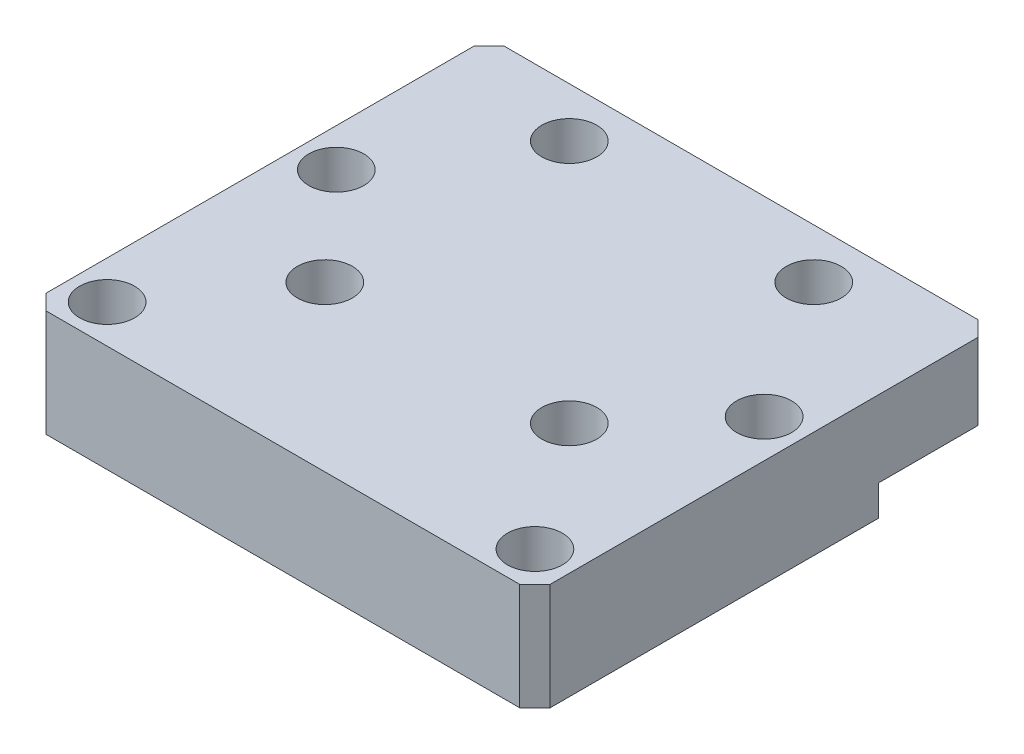
ISO-10303-21;
HEADER;
FILE_DESCRIPTION(('STEP AP214'),'2;1');
FILE_NAME('part.step','',(''),(''),'','','');
FILE_SCHEMA(('AUTOMOTIVE_DESIGN { 1 0 10303 214 1 1 1 1 }'));
ENDSEC;
DATA;
#1=APPLICATION_CONTEXT('core data for automotive mechanical design processes');
#2=APPLICATION_PROTOCOL_DEFINITION('international standard','automotive_design',2000,#1);
#3=PRODUCT_CONTEXT('',#1,'mechanical');
#4=PRODUCT('Part','Part','',(#3));
#5=PRODUCT_RELATED_PRODUCT_CATEGORY('part','',(#4));
#6=PRODUCT_DEFINITION_FORMATION('','',#4);
#7=PRODUCT_DEFINITION_CONTEXT('part definition',#1,'design');
#8=PRODUCT_DEFINITION('design','',#6,#7);
#9=PRODUCT_DEFINITION_SHAPE('','',#8);
#10=(LENGTH_UNIT() NAMED_UNIT(*) SI_UNIT(.MILLI.,.METRE.));
#11=(NAMED_UNIT(*) PLANE_ANGLE_UNIT() SI_UNIT($,.RADIAN.));
#12=(NAMED_UNIT(*) SI_UNIT($,.STERADIAN.) SOLID_ANGLE_UNIT());
#13=UNCERTAINTY_MEASURE_WITH_UNIT(LENGTH_MEASURE(1.E-05),#10,'distance_accuracy_value','');
#14=(GEOMETRIC_REPRESENTATION_CONTEXT(3) GLOBAL_UNCERTAINTY_ASSIGNED_CONTEXT((#13)) GLOBAL_UNIT_ASSIGNED_CONTEXT((#10,
#11,#12)) REPRESENTATION_CONTEXT('',''));
#15=CARTESIAN_POINT('',(0.,0.,0.));
#16=DIRECTION('',(0.,0.,1.));
#17=DIRECTION('',(1.,0.,0.));
#18=AXIS2_PLACEMENT_3D('',#15,#16,#17);
#19=CARTESIAN_POINT('',(14.6058681568461,-50.686690807351,-11.25));
#20=DIRECTION('',(-0.793353340291234,0.,-0.608761429008722));
#21=DIRECTION('',(-0.608761429008722,0.,0.793353340291234));
#22=AXIS2_PLACEMENT_3D('',#19,#20,#21);
#23=PLANE('',#22);
#24=DIRECTION('',(0.608761429008722,0.,-0.793353340291234));
#25=VECTOR('',#24,1.);
#26=CARTESIAN_POINT('',(14.6058681568461,0.,-11.25));
#27=LINE('',#26,#25);
#28=CARTESIAN_POINT('',(9.52631948153747,0.,-4.63020328375589));
#29=VERTEX_POINT('',#28);
#30=CARTESIAN_POINT('',(14.6058681568461,0.,-11.25));
#31=VERTEX_POINT('',#30);
#32=EDGE_CURVE('E227',#29,#31,#27,.T.);
#33=ORIENTED_EDGE('',*,*,#32,.F.);
#34=DIRECTION('',(0.,1.,0.));
#35=VECTOR('',#34,1.);
#36=CARTESIAN_POINT('',(9.52631948153747,2.,-4.63020328375589));
#37=LINE('',#36,#35);
#38=CARTESIAN_POINT('',(9.52631948153747,2.,-4.63020328375589));
#39=VERTEX_POINT('',#38);
#40=EDGE_CURVE('E393',#29,#39,#37,.T.);
#41=ORIENTED_EDGE('',*,*,#40,.T.);
#42=DIRECTION('',(0.608761429008722,0.,-0.793353340291234));
#43=VECTOR('',#42,1.);
#44=CARTESIAN_POINT('',(14.6058681568461,2.,-11.25));
#45=LINE('',#44,#43);
#46=CARTESIAN_POINT('',(14.6058681568461,1.99999999999999,-11.25));
#47=VERTEX_POINT('',#46);
#48=EDGE_CURVE('E228',#39,#47,#45,.T.);
#49=ORIENTED_EDGE('',*,*,#48,.T.);
#50=DIRECTION('',(0.,1.,0.));
#51=VECTOR('',#50,1.);
#52=CARTESIAN_POINT('',(14.6058681568461,-50.686690807351,-11.25));
#53=LINE('',#52,#51);
#54=EDGE_CURVE('E242',#31,#47,#53,.T.);
#55=ORIENTED_EDGE('',*,*,#54,.F.);
#56=EDGE_LOOP('',(#33,#41,#49,#55));
#57=FACE_BOUND('',#56,.T.);
#58=ADVANCED_FACE('F42',(#57),#23,.T.);
#59=CARTESIAN_POINT('',(16.5,7.,-11.25));
#60=DIRECTION('',(0.,0.,1.));
#61=DIRECTION('',(1.,0.,0.));
#62=AXIS2_PLACEMENT_3D('',#59,#60,#61);
#63=PLANE('',#62);
#64=DIRECTION('',(-1.,0.,0.));
#65=VECTOR('',#64,1.);
#66=CARTESIAN_POINT('',(-16.5,2.,-11.25));
#67=LINE('',#66,#65);
#68=CARTESIAN_POINT('',(16.5,2.,-11.25));
#69=VERTEX_POINT('',#68);
#70=EDGE_CURVE('E203',#69,#47,#67,.T.);
#71=ORIENTED_EDGE('',*,*,#70,.F.);
#72=DIRECTION('',(0.,-1.,0.));
#73=VECTOR('',#72,1.);
#74=CARTESIAN_POINT('',(16.5,7.,-11.25));
#75=LINE('',#74,#73);
#76=CARTESIAN_POINT('',(16.5,0.,-11.25));
#77=VERTEX_POINT('',#76);
#78=EDGE_CURVE('E192',#69,#77,#75,.T.);
#79=ORIENTED_EDGE('',*,*,#78,.T.);
#80=DIRECTION('',(-1.,0.,0.));
#81=VECTOR('',#80,1.);
#82=CARTESIAN_POINT('',(16.5,0.,-11.25));
#83=LINE('',#82,#81);
#84=EDGE_CURVE('E284',#77,#31,#83,.T.);
#85=ORIENTED_EDGE('',*,*,#84,.T.);
#86=ORIENTED_EDGE('',*,*,#54,.T.);
#87=EDGE_LOOP('',(#71,#79,#85,#86));
#88=FACE_BOUND('',#87,.T.);
#89=ADVANCED_FACE('F496',(#88),#63,.F.);
#90=CARTESIAN_POINT('',(-14.6058681568461,2.,-11.25));
#91=VERTEX_POINT('',#90);
#92=CARTESIAN_POINT('',(-16.5,2.,-11.25));
#93=VERTEX_POINT('',#92);
#94=EDGE_CURVE('E183',#91,#93,#67,.T.);
#95=ORIENTED_EDGE('',*,*,#94,.F.);
#96=DIRECTION('',(0.,1.,0.));
#97=VECTOR('',#96,1.);
#98=CARTESIAN_POINT('',(-14.6058681568461,-50.686690807351,-11.25));
#99=LINE('',#98,#97);
#100=CARTESIAN_POINT('',(-14.6058681568461,0.,-11.25));
#101=VERTEX_POINT('',#100);
#102=EDGE_CURVE('E231',#101,#91,#99,.T.);
#103=ORIENTED_EDGE('',*,*,#102,.F.);
#104=CARTESIAN_POINT('',(-16.5,0.,-11.25));
#105=VERTEX_POINT('',#104);
#106=EDGE_CURVE('E186',#101,#105,#83,.T.);
#107=ORIENTED_EDGE('',*,*,#106,.T.);
#108=DIRECTION('',(0.,-1.,0.));
#109=VECTOR('',#108,1.);
#110=CARTESIAN_POINT('',(-16.5,7.,-11.25));
#111=LINE('',#110,#109);
#112=EDGE_CURVE('E179',#93,#105,#111,.T.);
#113=ORIENTED_EDGE('',*,*,#112,.F.);
#114=EDGE_LOOP('',(#95,#103,#107,#113));
#115=FACE_BOUND('',#114,.T.);
#116=ADVANCED_FACE('F181',(#115),#63,.F.);
#117=CARTESIAN_POINT('',(-16.5,7.,11.25));
#118=DIRECTION('',(1.,0.,0.));
#119=DIRECTION('',(0.,0.,-1.));
#120=AXIS2_PLACEMENT_3D('',#117,#118,#119);
#121=PLANE('',#120);
#122=DIRECTION('',(0.,0.,1.));
#123=VECTOR('',#122,1.);
#124=CARTESIAN_POINT('',(-16.5,7.,11.25));
#125=LINE('',#124,#123);
#126=CARTESIAN_POINT('',(-16.5,7.,-17.75));
#127=VERTEX_POINT('',#126);
#128=CARTESIAN_POINT('',(-16.5,7.,10.25));
#129=VERTEX_POINT('',#128);
#130=EDGE_CURVE('E279',#127,#129,#125,.T.);
#131=ORIENTED_EDGE('',*,*,#130,.F.);
#132=DIRECTION('',(0.,-1.,0.));
#133=VECTOR('',#132,1.);
#134=CARTESIAN_POINT('',(-16.5,2.,-17.75));
#135=LINE('',#134,#133);
#136=CARTESIAN_POINT('',(-16.5,2.,-17.75));
#137=VERTEX_POINT('',#136);
#138=EDGE_CURVE('E208',#127,#137,#135,.T.);
#139=ORIENTED_EDGE('',*,*,#138,.T.);
#140=DIRECTION('',(0.,0.,-1.));
#141=VECTOR('',#140,1.);
#142=CARTESIAN_POINT('',(-16.5,2.,-11.25));
#143=LINE('',#142,#141);
#144=EDGE_CURVE('E198',#93,#137,#143,.T.);
#145=ORIENTED_EDGE('',*,*,#144,.F.);
#146=ORIENTED_EDGE('',*,*,#112,.T.);
#147=DIRECTION('',(0.,0.,1.));
#148=VECTOR('',#147,1.);
#149=CARTESIAN_POINT('',(-16.5,0.,11.25));
#150=LINE('',#149,#148);
#151=CARTESIAN_POINT('',(-16.5,0.,10.25));
#152=VERTEX_POINT('',#151);
#153=EDGE_CURVE('E278',#105,#152,#150,.T.);
#154=ORIENTED_EDGE('',*,*,#153,.T.);
#155=DIRECTION('',(0.,1.,0.));
#156=VECTOR('',#155,1.);
#157=CARTESIAN_POINT('',(-16.5,7.,10.25));
#158=LINE('',#157,#156);
#159=EDGE_CURVE('E344',#152,#129,#158,.T.);
#160=ORIENTED_EDGE('',*,*,#159,.T.);
#161=EDGE_LOOP('',(#131,#139,#145,#146,#154,#160));
#162=FACE_BOUND('',#161,.T.);
#163=ADVANCED_FACE('F206',(#162),#121,.F.);
#164=CARTESIAN_POINT('',(16.5,7.,11.25));
#165=DIRECTION('',(0.,0.,-1.));
#166=DIRECTION('',(-1.,0.,0.));
#167=AXIS2_PLACEMENT_3D('',#164,#165,#166);
#168=PLANE('',#167);
#169=DIRECTION('',(1.,0.,0.));
#170=VECTOR('',#169,1.);
#171=CARTESIAN_POINT('',(16.5,7.,11.25));
#172=LINE('',#171,#170);
#173=CARTESIAN_POINT('',(-15.5,7.,11.25));
#174=VERTEX_POINT('',#173);
#175=CARTESIAN_POINT('',(15.5,7.,11.25));
#176=VERTEX_POINT('',#175);
#177=EDGE_CURVE('E283',#174,#176,#172,.T.);
#178=ORIENTED_EDGE('',*,*,#177,.F.);
#179=DIRECTION('',(0.,-1.,0.));
#180=VECTOR('',#179,1.);
#181=CARTESIAN_POINT('',(-15.5,7.,11.25));
#182=LINE('',#181,#180);
#183=CARTESIAN_POINT('',(-15.5,0.,11.25));
#184=VERTEX_POINT('',#183);
#185=EDGE_CURVE('E352',#174,#184,#182,.T.);
#186=ORIENTED_EDGE('',*,*,#185,.T.);
#187=DIRECTION('',(1.,0.,0.));
#188=VECTOR('',#187,1.);
#189=CARTESIAN_POINT('',(16.5,0.,11.25));
#190=LINE('',#189,#188);
#191=CARTESIAN_POINT('',(15.5,0.,11.25));
#192=VERTEX_POINT('',#191);
#193=EDGE_CURVE('E293',#184,#192,#190,.T.);
#194=ORIENTED_EDGE('',*,*,#193,.T.);
#195=DIRECTION('',(0.,1.,0.));
#196=VECTOR('',#195,1.);
#197=CARTESIAN_POINT('',(15.5,7.,11.25));
#198=LINE('',#197,#196);
#199=EDGE_CURVE('E349',#192,#176,#198,.T.);
#200=ORIENTED_EDGE('',*,*,#199,.T.);
#201=EDGE_LOOP('',(#178,#186,#194,#200));
#202=FACE_BOUND('',#201,.T.);
#203=ADVANCED_FACE('F573',(#202),#168,.F.);
#204=CARTESIAN_POINT('',(16.5,7.,11.25));
#205=DIRECTION('',(-1.,0.,0.));
#206=DIRECTION('',(0.,0.,1.));
#207=AXIS2_PLACEMENT_3D('',#204,#205,#206);
#208=PLANE('',#207);
#209=DIRECTION('',(0.,0.,1.));
#210=VECTOR('',#209,1.);
#211=CARTESIAN_POINT('',(16.5,2.,-11.25));
#212=LINE('',#211,#210);
#213=CARTESIAN_POINT('',(16.5,2.,-17.75));
#214=VERTEX_POINT('',#213);
#215=EDGE_CURVE('E216',#214,#69,#212,.T.);
#216=ORIENTED_EDGE('',*,*,#215,.F.);
#217=DIRECTION('',(0.,1.,0.));
#218=VECTOR('',#217,1.);
#219=CARTESIAN_POINT('',(16.5,7.,-17.75));
#220=LINE('',#219,#218);
#221=CARTESIAN_POINT('',(16.5,7.,-17.75));
#222=VERTEX_POINT('',#221);
#223=EDGE_CURVE('E329',#214,#222,#220,.T.);
#224=ORIENTED_EDGE('',*,*,#223,.T.);
#225=DIRECTION('',(0.,0.,-1.));
#226=VECTOR('',#225,1.);
#227=CARTESIAN_POINT('',(16.5,7.,11.25));
#228=LINE('',#227,#226);
#229=CARTESIAN_POINT('',(16.5,7.,10.25));
#230=VERTEX_POINT('',#229);
#231=EDGE_CURVE('E193',#230,#222,#228,.T.);
#232=ORIENTED_EDGE('',*,*,#231,.F.);
#233=DIRECTION('',(0.,-1.,0.));
#234=VECTOR('',#233,1.);
#235=CARTESIAN_POINT('',(16.5,7.,10.25));
#236=LINE('',#235,#234);
#237=CARTESIAN_POINT('',(16.5,0.,10.25));
#238=VERTEX_POINT('',#237);
#239=EDGE_CURVE('E325',#230,#238,#236,.T.);
#240=ORIENTED_EDGE('',*,*,#239,.T.);
#241=DIRECTION('',(0.,0.,-1.));
#242=VECTOR('',#241,1.);
#243=CARTESIAN_POINT('',(16.5,0.,11.25));
#244=LINE('',#243,#242);
#245=EDGE_CURVE('E297',#238,#77,#244,.T.);
#246=ORIENTED_EDGE('',*,*,#245,.T.);
#247=ORIENTED_EDGE('',*,*,#78,.F.);
#248=EDGE_LOOP('',(#216,#224,#232,#240,#246,#247));
#249=FACE_BOUND('',#248,.T.);
#250=ADVANCED_FACE('F499',(#249),#208,.F.);
#251=CARTESIAN_POINT('',(0.,7.,0.));
#252=DIRECTION('',(0.,1.,0.));
#253=DIRECTION('',(0.,0.,1.));
#254=AXIS2_PLACEMENT_3D('',#251,#252,#253);
#255=PLANE('',#254);
#256=CARTESIAN_POINT('',(-8.,7.,0.5));
#257=DIRECTION('',(0.,-1.,0.));
#258=DIRECTION('',(0.,0.,-1.));
#259=AXIS2_PLACEMENT_3D('',#256,#257,#258);
#260=CIRCLE('',#259,1.8);
#261=CARTESIAN_POINT('',(-8.,7.,-1.3));
#262=VERTEX_POINT('',#261);
#263=EDGE_CURVE('E446',#262,#262,#260,.T.);
#264=ORIENTED_EDGE('',*,*,#263,.T.);
#265=EDGE_LOOP('',(#264));
#266=FACE_BOUND('',#265,.T.);
#267=CARTESIAN_POINT('',(8.,7.,0.5));
#268=DIRECTION('',(0.,-1.,0.));
#269=DIRECTION('',(0.,0.,-1.));
#270=AXIS2_PLACEMENT_3D('',#267,#268,#269);
#271=CIRCLE('',#270,1.8);
#272=CARTESIAN_POINT('',(8.,7.,-1.3));
#273=VERTEX_POINT('',#272);
#274=EDGE_CURVE('E462',#273,#273,#271,.T.);
#275=ORIENTED_EDGE('',*,*,#274,.T.);
#276=EDGE_LOOP('',(#275));
#277=FACE_BOUND('',#276,.T.);
#278=CARTESIAN_POINT('',(-8.,7.,-15.5));
#279=DIRECTION('',(0.,-1.,0.));
#280=DIRECTION('',(0.,0.,-1.));
#281=AXIS2_PLACEMENT_3D('',#278,#279,#280);
#282=CIRCLE('',#281,1.8);
#283=CARTESIAN_POINT('',(-8.,7.,-17.3));
#284=VERTEX_POINT('',#283);
#285=EDGE_CURVE('E368',#284,#284,#282,.T.);
#286=ORIENTED_EDGE('',*,*,#285,.T.);
#287=EDGE_LOOP('',(#286));
#288=FACE_BOUND('',#287,.T.);
#289=CARTESIAN_POINT('',(8.,7.,-15.5));
#290=DIRECTION('',(0.,-1.,0.));
#291=DIRECTION('',(0.,0.,-1.));
#292=AXIS2_PLACEMENT_3D('',#289,#290,#291);
#293=CIRCLE('',#292,1.8);
#294=CARTESIAN_POINT('',(8.,7.,-17.3));
#295=VERTEX_POINT('',#294);
#296=EDGE_CURVE('E219',#295,#295,#293,.T.);
#297=ORIENTED_EDGE('',*,*,#296,.T.);
#298=EDGE_LOOP('',(#297));
#299=FACE_BOUND('',#298,.T.);
#300=CARTESIAN_POINT('',(-14.,7.,-6.25));
#301=DIRECTION('',(0.,1.,0.));
#302=DIRECTION('',(0.,0.,1.));
#303=AXIS2_PLACEMENT_3D('',#300,#301,#302);
#304=CIRCLE('',#303,1.8);
#305=CARTESIAN_POINT('',(-14.,7.,-4.45));
#306=VERTEX_POINT('',#305);
#307=EDGE_CURVE('E246',#306,#306,#304,.T.);
#308=ORIENTED_EDGE('',*,*,#307,.F.);
#309=EDGE_LOOP('',(#308));
#310=FACE_BOUND('',#309,.T.);
#311=CARTESIAN_POINT('',(14.,7.,-6.25));
#312=DIRECTION('',(0.,1.,0.));
#313=DIRECTION('',(0.,0.,1.));
#314=AXIS2_PLACEMENT_3D('',#311,#312,#313);
#315=CIRCLE('',#314,1.8);
#316=CARTESIAN_POINT('',(14.,7.,-4.45));
#317=VERTEX_POINT('',#316);
#318=EDGE_CURVE('E254',#317,#317,#315,.T.);
#319=ORIENTED_EDGE('',*,*,#318,.F.);
#320=EDGE_LOOP('',(#319));
#321=FACE_BOUND('',#320,.T.);
#322=CARTESIAN_POINT('',(14.,7.,8.75));
#323=DIRECTION('',(0.,1.,0.));
#324=DIRECTION('',(0.,0.,1.));
#325=AXIS2_PLACEMENT_3D('',#322,#323,#324);
#326=CIRCLE('',#325,1.8);
#327=CARTESIAN_POINT('',(14.,7.,10.55));
#328=VERTEX_POINT('',#327);
#329=EDGE_CURVE('E262',#328,#328,#326,.T.);
#330=ORIENTED_EDGE('',*,*,#329,.F.);
#331=EDGE_LOOP('',(#330));
#332=FACE_BOUND('',#331,.T.);
#333=CARTESIAN_POINT('',(-14.,7.,8.75));
#334=DIRECTION('',(0.,1.,0.));
#335=DIRECTION('',(0.,0.,1.));
#336=AXIS2_PLACEMENT_3D('',#333,#334,#335);
#337=CIRCLE('',#336,1.8);
#338=CARTESIAN_POINT('',(-14.,7.,10.55));
#339=VERTEX_POINT('',#338);
#340=EDGE_CURVE('E270',#339,#339,#337,.T.);
#341=ORIENTED_EDGE('',*,*,#340,.F.);
#342=EDGE_LOOP('',(#341));
#343=FACE_BOUND('',#342,.T.);
#344=ORIENTED_EDGE('',*,*,#231,.T.);
#345=DIRECTION('',(-0.707106781186545,0.,-0.70710678118655));
#346=VECTOR('',#345,1.);
#347=CARTESIAN_POINT('',(17.125,7.,-17.1249999999999));
#348=LINE('',#347,#346);
#349=CARTESIAN_POINT('',(15.5,7.,-18.75));
#350=VERTEX_POINT('',#349);
#351=EDGE_CURVE('E341',#222,#350,#348,.T.);
#352=ORIENTED_EDGE('',*,*,#351,.T.);
#353=DIRECTION('',(1.,0.,0.));
#354=VECTOR('',#353,1.);
#355=CARTESIAN_POINT('',(-16.5,7.,-18.75));
#356=LINE('',#355,#354);
#357=CARTESIAN_POINT('',(-15.5,7.,-18.75));
#358=VERTEX_POINT('',#357);
#359=EDGE_CURVE('E223',#358,#350,#356,.T.);
#360=ORIENTED_EDGE('',*,*,#359,.F.);
#361=DIRECTION('',(-0.707106781186548,0.,0.707106781186548));
#362=VECTOR('',#361,1.);
#363=CARTESIAN_POINT('',(-17.125,7.,-17.125));
#364=LINE('',#363,#362);
#365=EDGE_CURVE('E338',#358,#127,#364,.T.);
#366=ORIENTED_EDGE('',*,*,#365,.T.);
#367=ORIENTED_EDGE('',*,*,#130,.T.);
#368=DIRECTION('',(-0.707106781186549,0.,-0.707106781186546));
#369=VECTOR('',#368,1.);
#370=CARTESIAN_POINT('',(-13.375,7.,13.375));
#371=LINE('',#370,#369);
#372=EDGE_CURVE('E335',#129,#174,#371,.F.);
#373=ORIENTED_EDGE('',*,*,#372,.T.);
#374=ORIENTED_EDGE('',*,*,#177,.T.);
#375=DIRECTION('',(-0.707106781186548,0.,0.707106781186548));
#376=VECTOR('',#375,1.);
#377=CARTESIAN_POINT('',(13.375,7.,13.375));
#378=LINE('',#377,#376);
#379=EDGE_CURVE('E332',#176,#230,#378,.F.);
#380=ORIENTED_EDGE('',*,*,#379,.T.);
#381=EDGE_LOOP('',(#344,#352,#360,#366,#367,#373,#374,#380));
#382=FACE_BOUND('',#381,.T.);
#383=ADVANCED_FACE('F564',(#266,#277,#288,#299,#310,#321,#332,#343,#382),#255,.T.);
#384=CARTESIAN_POINT('',(0.,0.,0.));
#385=DIRECTION('',(0.,1.,0.));
#386=DIRECTION('',(0.,0.,1.));
#387=AXIS2_PLACEMENT_3D('',#384,#385,#386);
#388=PLANE('',#387);
#389=CARTESIAN_POINT('',(-14.,0.,-6.25));
#390=DIRECTION('',(0.,1.,0.));
#391=DIRECTION('',(0.,0.,1.));
#392=AXIS2_PLACEMENT_3D('',#389,#390,#391);
#393=CIRCLE('',#392,1.8);
#394=CARTESIAN_POINT('',(-14.,0.,-4.45));
#395=VERTEX_POINT('',#394);
#396=EDGE_CURVE('E250',#395,#395,#393,.T.);
#397=ORIENTED_EDGE('',*,*,#396,.T.);
#398=EDGE_LOOP('',(#397));
#399=FACE_BOUND('',#398,.T.);
#400=CARTESIAN_POINT('',(14.,0.,-6.25));
#401=DIRECTION('',(0.,1.,0.));
#402=DIRECTION('',(0.,0.,1.));
#403=AXIS2_PLACEMENT_3D('',#400,#401,#402);
#404=CIRCLE('',#403,1.8);
#405=CARTESIAN_POINT('',(14.,0.,-4.45));
#406=VERTEX_POINT('',#405);
#407=EDGE_CURVE('E258',#406,#406,#404,.T.);
#408=ORIENTED_EDGE('',*,*,#407,.T.);
#409=EDGE_LOOP('',(#408));
#410=FACE_BOUND('',#409,.T.);
#411=CARTESIAN_POINT('',(14.,0.,8.75));
#412=DIRECTION('',(0.,1.,0.));
#413=DIRECTION('',(0.,0.,1.));
#414=AXIS2_PLACEMENT_3D('',#411,#412,#413);
#415=CIRCLE('',#414,1.8);
#416=CARTESIAN_POINT('',(14.,0.,10.55));
#417=VERTEX_POINT('',#416);
#418=EDGE_CURVE('E266',#417,#417,#415,.T.);
#419=ORIENTED_EDGE('',*,*,#418,.T.);
#420=EDGE_LOOP('',(#419));
#421=FACE_BOUND('',#420,.T.);
#422=CARTESIAN_POINT('',(-14.,0.,8.75));
#423=DIRECTION('',(0.,1.,0.));
#424=DIRECTION('',(0.,0.,1.));
#425=AXIS2_PLACEMENT_3D('',#422,#423,#424);
#426=CIRCLE('',#425,1.8);
#427=CARTESIAN_POINT('',(-14.,0.,10.55));
#428=VERTEX_POINT('',#427);
#429=EDGE_CURVE('E274',#428,#428,#426,.T.);
#430=ORIENTED_EDGE('',*,*,#429,.T.);
#431=EDGE_LOOP('',(#430));
#432=FACE_BOUND('',#431,.T.);
#433=CARTESIAN_POINT('',(8.,0.,0.5));
#434=DIRECTION('',(0.,-1.,0.));
#435=DIRECTION('',(0.,0.,-1.));
#436=AXIS2_PLACEMENT_3D('',#433,#434,#435);
#437=CIRCLE('',#436,3.);
#438=CARTESIAN_POINT('',(9.86781569727196,0.,-1.84760825544307));
#439=VERTEX_POINT('',#438);
#440=CARTESIAN_POINT('',(6.14182167144962,0.,2.85524378765887));
#441=VERTEX_POINT('',#440);
#442=EDGE_CURVE('E450',#439,#441,#437,.T.);
#443=ORIENTED_EDGE('',*,*,#442,.F.);
#444=CARTESIAN_POINT('',(11.1130261621199,0.,-3.41268042573845));
#445=DIRECTION('',(0.,1.,0.));
#446=DIRECTION('',(0.,0.,1.));
#447=AXIS2_PLACEMENT_3D('',#444,#445,#446);
#448=CIRCLE('',#447,2.);
#449=EDGE_CURVE('E390',#439,#29,#448,.F.);
#450=ORIENTED_EDGE('',*,*,#449,.T.);
#451=ORIENTED_EDGE('',*,*,#32,.T.);
#452=ORIENTED_EDGE('',*,*,#84,.F.);
#453=ORIENTED_EDGE('',*,*,#245,.F.);
#454=DIRECTION('',(0.707106781186548,0.,-0.707106781186548));
#455=VECTOR('',#454,1.);
#456=CARTESIAN_POINT('',(16.5,0.,10.25));
#457=LINE('',#456,#455);
#458=EDGE_CURVE('E356',#238,#192,#457,.F.);
#459=ORIENTED_EDGE('',*,*,#458,.T.);
#460=ORIENTED_EDGE('',*,*,#193,.F.);
#461=DIRECTION('',(0.707106781186549,0.,0.707106781186546));
#462=VECTOR('',#461,1.);
#463=CARTESIAN_POINT('',(-15.5,0.,11.25));
#464=LINE('',#463,#462);
#465=EDGE_CURVE('E359',#184,#152,#464,.F.);
#466=ORIENTED_EDGE('',*,*,#465,.T.);
#467=ORIENTED_EDGE('',*,*,#153,.F.);
#468=ORIENTED_EDGE('',*,*,#106,.F.);
#469=DIRECTION('',(0.608761429008722,0.,0.793353340291234));
#470=VECTOR('',#469,1.);
#471=CARTESIAN_POINT('',(-14.6058681568461,0.,-11.25));
#472=LINE('',#471,#470);
#473=CARTESIAN_POINT('',(-9.52631948153747,0.,-4.63020328375589));
#474=VERTEX_POINT('',#473);
#475=EDGE_CURVE('E234',#101,#474,#472,.T.);
#476=ORIENTED_EDGE('',*,*,#475,.T.);
#477=CARTESIAN_POINT('',(-11.1130261621199,0.,-3.41268042573845));
#478=DIRECTION('',(0.,1.,0.));
#479=DIRECTION('',(0.,0.,1.));
#480=AXIS2_PLACEMENT_3D('',#477,#478,#479);
#481=CIRCLE('',#480,2.);
#482=CARTESIAN_POINT('',(-9.86781569727196,0.,-1.84760825544307));
#483=VERTEX_POINT('',#482);
#484=EDGE_CURVE('E381',#474,#483,#481,.F.);
#485=ORIENTED_EDGE('',*,*,#484,.T.);
#486=CARTESIAN_POINT('',(-8.,0.,0.5));
#487=DIRECTION('',(0.,-1.,0.));
#488=DIRECTION('',(0.,0.,-1.));
#489=AXIS2_PLACEMENT_3D('',#486,#487,#488);
#490=CIRCLE('',#489,3.);
#491=CARTESIAN_POINT('',(-6.14182167144962,0.,2.85524378765887));
#492=VERTEX_POINT('',#491);
#493=EDGE_CURVE('E428',#492,#483,#490,.T.);
#494=ORIENTED_EDGE('',*,*,#493,.F.);
#495=CARTESIAN_POINT('',(-4.9030361190827,0.,4.42540631276479));
#496=DIRECTION('',(0.,1.,0.));
#497=DIRECTION('',(0.,0.,1.));
#498=AXIS2_PLACEMENT_3D('',#495,#496,#497);
#499=CIRCLE('',#498,2.);
#500=CARTESIAN_POINT('',(-3.59555982066064,0.,2.91196462936084));
#501=VERTEX_POINT('',#500);
#502=EDGE_CURVE('E384',#492,#501,#499,.F.);
#503=ORIENTED_EDGE('',*,*,#502,.T.);
#504=CARTESIAN_POINT('',(0.,0.,-1.25));
#505=DIRECTION('',(0.,1.,0.));
#506=DIRECTION('',(0.,0.,1.));
#507=AXIS2_PLACEMENT_3D('',#504,#505,#506);
#508=CIRCLE('',#507,5.5);
#509=CARTESIAN_POINT('',(3.59555982066065,0.,2.91196462936084));
#510=VERTEX_POINT('',#509);
#511=EDGE_CURVE('E308',#501,#510,#508,.T.);
#512=ORIENTED_EDGE('',*,*,#511,.T.);
#513=CARTESIAN_POINT('',(4.9030361190827,0.,4.42540631276479));
#514=DIRECTION('',(0.,1.,0.));
#515=DIRECTION('',(0.,0.,1.));
#516=AXIS2_PLACEMENT_3D('',#513,#514,#515);
#517=CIRCLE('',#516,2.);
#518=EDGE_CURVE('E387',#510,#441,#517,.F.);
#519=ORIENTED_EDGE('',*,*,#518,.T.);
#520=EDGE_LOOP('',(#443,#450,#451,#452,#453,#459,#460,#466,#467,#468,#476,#485,#494,#503,#512,#519));
#521=FACE_BOUND('',#520,.T.);
#522=ADVANCED_FACE('F432',(#399,#410,#421,#432,#521),#388,.F.);
#523=CARTESIAN_POINT('',(-14.,7.,8.75));
#524=DIRECTION('',(0.,1.,0.));
#525=DIRECTION('',(0.,0.,1.));
#526=AXIS2_PLACEMENT_3D('',#523,#524,#525);
#527=CYLINDRICAL_SURFACE('',#526,1.8);
#528=ORIENTED_EDGE('',*,*,#429,.F.);
#529=EDGE_LOOP('',(#528));
#530=FACE_BOUND('',#529,.T.);
#531=ORIENTED_EDGE('',*,*,#340,.T.);
#532=EDGE_LOOP('',(#531));
#533=FACE_BOUND('',#532,.T.);
#534=ADVANCED_FACE('F559',(#530,#533),#527,.F.);
#535=CARTESIAN_POINT('',(14.,7.,8.75));
#536=DIRECTION('',(0.,1.,0.));
#537=DIRECTION('',(0.,0.,1.));
#538=AXIS2_PLACEMENT_3D('',#535,#536,#537);
#539=CYLINDRICAL_SURFACE('',#538,1.8);
#540=ORIENTED_EDGE('',*,*,#418,.F.);
#541=EDGE_LOOP('',(#540));
#542=FACE_BOUND('',#541,.T.);
#543=ORIENTED_EDGE('',*,*,#329,.T.);
#544=EDGE_LOOP('',(#543));
#545=FACE_BOUND('',#544,.T.);
#546=ADVANCED_FACE('F555',(#542,#545),#539,.F.);
#547=CARTESIAN_POINT('',(14.,7.,-6.25));
#548=DIRECTION('',(0.,1.,0.));
#549=DIRECTION('',(0.,0.,1.));
#550=AXIS2_PLACEMENT_3D('',#547,#548,#549);
#551=CYLINDRICAL_SURFACE('',#550,1.8);
#552=ORIENTED_EDGE('',*,*,#407,.F.);
#553=EDGE_LOOP('',(#552));
#554=FACE_BOUND('',#553,.T.);
#555=ORIENTED_EDGE('',*,*,#318,.T.);
#556=EDGE_LOOP('',(#555));
#557=FACE_BOUND('',#556,.T.);
#558=ADVANCED_FACE('F551',(#554,#557),#551,.F.);
#559=CARTESIAN_POINT('',(-14.,7.,-6.25));
#560=DIRECTION('',(0.,1.,0.));
#561=DIRECTION('',(0.,0.,1.));
#562=AXIS2_PLACEMENT_3D('',#559,#560,#561);
#563=CYLINDRICAL_SURFACE('',#562,1.8);
#564=ORIENTED_EDGE('',*,*,#396,.F.);
#565=EDGE_LOOP('',(#564));
#566=FACE_BOUND('',#565,.T.);
#567=ORIENTED_EDGE('',*,*,#307,.T.);
#568=EDGE_LOOP('',(#567));
#569=FACE_BOUND('',#568,.T.);
#570=ADVANCED_FACE('F548',(#566,#569),#563,.F.);
#571=CARTESIAN_POINT('',(-14.6058681568461,-50.686690807351,-11.25));
#572=DIRECTION('',(0.793353340291234,0.,-0.608761429008722));
#573=DIRECTION('',(-0.608761429008722,0.,-0.793353340291234));
#574=AXIS2_PLACEMENT_3D('',#571,#572,#573);
#575=PLANE('',#574);
#576=DIRECTION('',(0.608761429008722,0.,0.793353340291234));
#577=VECTOR('',#576,1.);
#578=CARTESIAN_POINT('',(-14.6058681568461,2.,-11.25));
#579=LINE('',#578,#577);
#580=CARTESIAN_POINT('',(-9.52631948153747,2.,-4.63020328375589));
#581=VERTEX_POINT('',#580);
#582=EDGE_CURVE('E199',#91,#581,#579,.T.);
#583=ORIENTED_EDGE('',*,*,#582,.T.);
#584=DIRECTION('',(0.,1.,0.));
#585=VECTOR('',#584,1.);
#586=CARTESIAN_POINT('',(-9.52631948153747,0.,-4.63020328375589));
#587=LINE('',#586,#585);
#588=EDGE_CURVE('E408',#581,#474,#587,.F.);
#589=ORIENTED_EDGE('',*,*,#588,.T.);
#590=ORIENTED_EDGE('',*,*,#475,.F.);
#591=ORIENTED_EDGE('',*,*,#102,.T.);
#592=EDGE_LOOP('',(#583,#589,#590,#591));
#593=FACE_BOUND('',#592,.T.);
#594=ADVANCED_FACE('F544',(#593),#575,.T.);
#595=CARTESIAN_POINT('',(0.,2.,0.));
#596=DIRECTION('',(0.,1.,0.));
#597=DIRECTION('',(0.,0.,1.));
#598=AXIS2_PLACEMENT_3D('',#595,#596,#597);
#599=PLANE('',#598);
#600=CARTESIAN_POINT('',(-8.,2.,-15.5));
#601=DIRECTION('',(0.,1.,0.));
#602=DIRECTION('',(0.,0.,1.));
#603=AXIS2_PLACEMENT_3D('',#600,#601,#602);
#604=CIRCLE('',#603,3.);
#605=CARTESIAN_POINT('',(-8.,2.,-12.5));
#606=VERTEX_POINT('',#605);
#607=EDGE_CURVE('E363',#606,#606,#604,.T.);
#608=ORIENTED_EDGE('',*,*,#607,.T.);
#609=EDGE_LOOP('',(#608));
#610=FACE_BOUND('',#609,.T.);
#611=CARTESIAN_POINT('',(8.,2.,-15.5));
#612=DIRECTION('',(0.,1.,0.));
#613=DIRECTION('',(0.,0.,1.));
#614=AXIS2_PLACEMENT_3D('',#611,#612,#613);
#615=CIRCLE('',#614,3.);
#616=CARTESIAN_POINT('',(8.,2.,-12.5));
#617=VERTEX_POINT('',#616);
#618=EDGE_CURVE('E211',#617,#617,#615,.T.);
#619=ORIENTED_EDGE('',*,*,#618,.T.);
#620=EDGE_LOOP('',(#619));
#621=FACE_BOUND('',#620,.T.);
#622=CARTESIAN_POINT('',(0.,2.,-1.25));
#623=DIRECTION('',(0.,1.,0.));
#624=DIRECTION('',(0.,0.,1.));
#625=AXIS2_PLACEMENT_3D('',#622,#623,#624);
#626=CIRCLE('',#625,5.5);
#627=CARTESIAN_POINT('',(3.59555982066065,2.,2.91196462936084));
#628=VERTEX_POINT('',#627);
#629=CARTESIAN_POINT('',(-3.59555982066064,2.,2.91196462936084));
#630=VERTEX_POINT('',#629);
#631=EDGE_CURVE('E201',#628,#630,#626,.F.);
#632=ORIENTED_EDGE('',*,*,#631,.T.);
#633=CARTESIAN_POINT('',(-4.9030361190827,2.,4.42540631276479));
#634=DIRECTION('',(0.,1.,0.));
#635=DIRECTION('',(0.,0.,1.));
#636=AXIS2_PLACEMENT_3D('',#633,#634,#635);
#637=CIRCLE('',#636,2.);
#638=CARTESIAN_POINT('',(-6.14182167144962,2.,2.85524378765887));
#639=VERTEX_POINT('',#638);
#640=EDGE_CURVE('E51',#630,#639,#637,.T.);
#641=ORIENTED_EDGE('',*,*,#640,.T.);
#642=CARTESIAN_POINT('',(-8.,2.,0.5));
#643=DIRECTION('',(0.,1.,0.));
#644=DIRECTION('',(0.,0.,1.));
#645=AXIS2_PLACEMENT_3D('',#642,#643,#644);
#646=CIRCLE('',#645,3.);
#647=CARTESIAN_POINT('',(-9.86781569727196,2.,-1.84760825544307));
#648=VERTEX_POINT('',#647);
#649=EDGE_CURVE('E63',#639,#648,#646,.T.);
#650=ORIENTED_EDGE('',*,*,#649,.T.);
#651=CARTESIAN_POINT('',(-11.1130261621199,2.,-3.41268042573845));
#652=DIRECTION('',(0.,1.,0.));
#653=DIRECTION('',(0.,0.,1.));
#654=AXIS2_PLACEMENT_3D('',#651,#652,#653);
#655=CIRCLE('',#654,2.);
#656=EDGE_CURVE('E11',#648,#581,#655,.T.);
#657=ORIENTED_EDGE('',*,*,#656,.T.);
#658=ORIENTED_EDGE('',*,*,#582,.F.);
#659=ORIENTED_EDGE('',*,*,#94,.T.);
#660=ORIENTED_EDGE('',*,*,#144,.T.);
#661=DIRECTION('',(0.707106781186548,0.,-0.707106781186548));
#662=VECTOR('',#661,1.);
#663=CARTESIAN_POINT('',(-16.5,2.,-17.75));
#664=LINE('',#663,#662);
#665=CARTESIAN_POINT('',(-15.5,2.,-18.75));
#666=VERTEX_POINT('',#665);
#667=EDGE_CURVE('E319',#137,#666,#664,.T.);
#668=ORIENTED_EDGE('',*,*,#667,.T.);
#669=DIRECTION('',(1.,0.,0.));
#670=VECTOR('',#669,1.);
#671=CARTESIAN_POINT('',(-16.5,2.,-18.75));
#672=LINE('',#671,#670);
#673=CARTESIAN_POINT('',(15.5,2.,-18.75));
#674=VERTEX_POINT('',#673);
#675=EDGE_CURVE('E210',#666,#674,#672,.T.);
#676=ORIENTED_EDGE('',*,*,#675,.T.);
#677=DIRECTION('',(0.707106781186545,0.,0.70710678118655));
#678=VECTOR('',#677,1.);
#679=CARTESIAN_POINT('',(15.5,2.,-18.75));
#680=LINE('',#679,#678);
#681=EDGE_CURVE('E322',#674,#214,#680,.T.);
#682=ORIENTED_EDGE('',*,*,#681,.T.);
#683=ORIENTED_EDGE('',*,*,#215,.T.);
#684=ORIENTED_EDGE('',*,*,#70,.T.);
#685=ORIENTED_EDGE('',*,*,#48,.F.);
#686=CARTESIAN_POINT('',(11.1130261621199,2.,-3.41268042573845));
#687=DIRECTION('',(0.,1.,0.));
#688=DIRECTION('',(0.,0.,1.));
#689=AXIS2_PLACEMENT_3D('',#686,#687,#688);
#690=CIRCLE('',#689,2.);
#691=CARTESIAN_POINT('',(9.86781569727196,2.,-1.84760825544307));
#692=VERTEX_POINT('',#691);
#693=EDGE_CURVE('E411',#39,#692,#690,.T.);
#694=ORIENTED_EDGE('',*,*,#693,.T.);
#695=CARTESIAN_POINT('',(8.,2.,0.5));
#696=DIRECTION('',(0.,1.,0.));
#697=DIRECTION('',(0.,0.,1.));
#698=AXIS2_PLACEMENT_3D('',#695,#696,#697);
#699=CIRCLE('',#698,3.);
#700=CARTESIAN_POINT('',(6.14182167144962,2.,2.85524378765887));
#701=VERTEX_POINT('',#700);
#702=EDGE_CURVE('E361',#692,#701,#699,.T.);
#703=ORIENTED_EDGE('',*,*,#702,.T.);
#704=CARTESIAN_POINT('',(4.9030361190827,2.,4.42540631276479));
#705=DIRECTION('',(0.,1.,0.));
#706=DIRECTION('',(0.,0.,1.));
#707=AXIS2_PLACEMENT_3D('',#704,#705,#706);
#708=CIRCLE('',#707,2.);
#709=EDGE_CURVE('E415',#701,#628,#708,.T.);
#710=ORIENTED_EDGE('',*,*,#709,.T.);
#711=EDGE_LOOP('',(#632,#641,#650,#657,#658,#659,#660,#668,#676,#682,#683,#684,#685,#694,#703,#710));
#712=FACE_BOUND('',#711,.T.);
#713=ADVANCED_FACE('F197',(#610,#621,#712),#599,.F.);
#714=CARTESIAN_POINT('',(-16.5,40.8415425180354,-18.75));
#715=DIRECTION('',(0.,0.,-1.));
#716=DIRECTION('',(-1.,0.,0.));
#717=AXIS2_PLACEMENT_3D('',#714,#715,#716);
#718=PLANE('',#717);
#719=ORIENTED_EDGE('',*,*,#359,.T.);
#720=DIRECTION('',(0.,-1.,0.));
#721=VECTOR('',#720,1.);
#722=CARTESIAN_POINT('',(15.5,2.,-18.75));
#723=LINE('',#722,#721);
#724=EDGE_CURVE('E315',#350,#674,#723,.T.);
#725=ORIENTED_EDGE('',*,*,#724,.T.);
#726=ORIENTED_EDGE('',*,*,#675,.F.);
#727=DIRECTION('',(0.,1.,0.));
#728=VECTOR('',#727,1.);
#729=CARTESIAN_POINT('',(-15.5,7.,-18.75));
#730=LINE('',#729,#728);
#731=EDGE_CURVE('E312',#666,#358,#730,.T.);
#732=ORIENTED_EDGE('',*,*,#731,.T.);
#733=EDGE_LOOP('',(#719,#725,#726,#732));
#734=FACE_BOUND('',#733,.T.);
#735=ADVANCED_FACE('F524',(#734),#718,.T.);
#736=CARTESIAN_POINT('',(0.,-50.686690807351,-1.25));
#737=DIRECTION('',(0.,-1.,0.));
#738=DIRECTION('',(0.,0.,-1.));
#739=AXIS2_PLACEMENT_3D('',#736,#737,#738);
#740=CYLINDRICAL_SURFACE('',#739,5.5);
#741=ORIENTED_EDGE('',*,*,#631,.F.);
#742=DIRECTION('',(0.,-1.,0.));
#743=VECTOR('',#742,1.);
#744=CARTESIAN_POINT('',(3.59555982066065,-50.686690807351,2.91196462936084));
#745=LINE('',#744,#743);
#746=EDGE_CURVE('E399',#628,#510,#745,.T.);
#747=ORIENTED_EDGE('',*,*,#746,.T.);
#748=ORIENTED_EDGE('',*,*,#511,.F.);
#749=DIRECTION('',(0.,-1.,0.));
#750=VECTOR('',#749,1.);
#751=CARTESIAN_POINT('',(-3.59555982066064,-50.686690807351,2.91196462936084));
#752=LINE('',#751,#750);
#753=EDGE_CURVE('E396',#501,#630,#752,.F.);
#754=ORIENTED_EDGE('',*,*,#753,.T.);
#755=EDGE_LOOP('',(#741,#747,#748,#754));
#756=FACE_BOUND('',#755,.T.);
#757=ADVANCED_FACE('F521',(#756),#740,.F.);
#758=CARTESIAN_POINT('',(15.5,40.8415425180354,-18.75));
#759=DIRECTION('',(0.70710678118655,0.,-0.707106781186545));
#760=DIRECTION('',(0.,1.,0.));
#761=AXIS2_PLACEMENT_3D('',#758,#759,#760);
#762=PLANE('',#761);
#763=ORIENTED_EDGE('',*,*,#351,.F.);
#764=ORIENTED_EDGE('',*,*,#223,.F.);
#765=ORIENTED_EDGE('',*,*,#681,.F.);
#766=ORIENTED_EDGE('',*,*,#724,.F.);
#767=EDGE_LOOP('',(#763,#764,#765,#766));
#768=FACE_BOUND('',#767,.T.);
#769=ADVANCED_FACE('F523',(#768),#762,.T.);
#770=CARTESIAN_POINT('',(-16.5,7.,-17.75));
#771=DIRECTION('',(-0.707106781186547,0.,-0.707106781186547));
#772=DIRECTION('',(0.,1.,0.));
#773=AXIS2_PLACEMENT_3D('',#770,#771,#772);
#774=PLANE('',#773);
#775=ORIENTED_EDGE('',*,*,#365,.F.);
#776=ORIENTED_EDGE('',*,*,#731,.F.);
#777=ORIENTED_EDGE('',*,*,#667,.F.);
#778=ORIENTED_EDGE('',*,*,#138,.F.);
#779=EDGE_LOOP('',(#775,#776,#777,#778));
#780=FACE_BOUND('',#779,.T.);
#781=ADVANCED_FACE('F530',(#780),#774,.T.);
#782=CARTESIAN_POINT('',(-15.5,7.,11.25));
#783=DIRECTION('',(0.707106781186546,0.,-0.707106781186549));
#784=DIRECTION('',(0.,-1.,0.));
#785=AXIS2_PLACEMENT_3D('',#782,#783,#784);
#786=PLANE('',#785);
#787=ORIENTED_EDGE('',*,*,#372,.F.);
#788=ORIENTED_EDGE('',*,*,#159,.F.);
#789=ORIENTED_EDGE('',*,*,#465,.F.);
#790=ORIENTED_EDGE('',*,*,#185,.F.);
#791=EDGE_LOOP('',(#787,#788,#789,#790));
#792=FACE_BOUND('',#791,.T.);
#793=ADVANCED_FACE('F683',(#792),#786,.F.);
#794=CARTESIAN_POINT('',(16.5,7.,10.25));
#795=DIRECTION('',(-0.707106781186547,0.,-0.707106781186547));
#796=DIRECTION('',(0.,-1.,0.));
#797=AXIS2_PLACEMENT_3D('',#794,#795,#796);
#798=PLANE('',#797);
#799=ORIENTED_EDGE('',*,*,#379,.F.);
#800=ORIENTED_EDGE('',*,*,#199,.F.);
#801=ORIENTED_EDGE('',*,*,#458,.F.);
#802=ORIENTED_EDGE('',*,*,#239,.F.);
#803=EDGE_LOOP('',(#799,#800,#801,#802));
#804=FACE_BOUND('',#803,.T.);
#805=ADVANCED_FACE('F692',(#804),#798,.F.);
#806=CARTESIAN_POINT('',(8.,0.,-15.5));
#807=DIRECTION('',(0.,-1.,0.));
#808=DIRECTION('',(0.,0.,-1.));
#809=AXIS2_PLACEMENT_3D('',#806,#807,#808);
#810=CYLINDRICAL_SURFACE('',#809,3.);
#811=CARTESIAN_POINT('',(8.,4.4,-15.5));
#812=DIRECTION('',(0.,-1.,0.));
#813=DIRECTION('',(0.,0.,-1.));
#814=AXIS2_PLACEMENT_3D('',#811,#812,#813);
#815=CIRCLE('',#814,3.);
#816=CARTESIAN_POINT('',(8.,4.4,-18.5));
#817=VERTEX_POINT('',#816);
#818=EDGE_CURVE('E367',#817,#817,#815,.T.);
#819=ORIENTED_EDGE('',*,*,#818,.F.);
#820=EDGE_LOOP('',(#819));
#821=FACE_BOUND('',#820,.T.);
#822=ORIENTED_EDGE('',*,*,#618,.F.);
#823=EDGE_LOOP('',(#822));
#824=FACE_BOUND('',#823,.T.);
#825=ADVANCED_FACE('F700',(#821,#824),#810,.F.);
#826=CARTESIAN_POINT('',(8.,0.,-15.5));
#827=DIRECTION('',(0.,-1.,0.));
#828=DIRECTION('',(0.,0.,-1.));
#829=AXIS2_PLACEMENT_3D('',#826,#827,#828);
#830=CYLINDRICAL_SURFACE('',#829,1.8);
#831=ORIENTED_EDGE('',*,*,#296,.F.);
#832=EDGE_LOOP('',(#831));
#833=FACE_BOUND('',#832,.T.);
#834=CARTESIAN_POINT('',(8.,4.4,-15.5));
#835=DIRECTION('',(0.,-1.,0.));
#836=DIRECTION('',(0.,0.,-1.));
#837=AXIS2_PLACEMENT_3D('',#834,#835,#836);
#838=CIRCLE('',#837,1.8);
#839=CARTESIAN_POINT('',(8.,4.4,-17.3));
#840=VERTEX_POINT('',#839);
#841=EDGE_CURVE('E480',#840,#840,#838,.T.);
#842=ORIENTED_EDGE('',*,*,#841,.T.);
#843=EDGE_LOOP('',(#842));
#844=FACE_BOUND('',#843,.T.);
#845=ADVANCED_FACE('F713',(#833,#844),#830,.F.);
#846=CARTESIAN_POINT('',(9.8,4.4,-15.5));
#847=DIRECTION('',(0.,1.,0.));
#848=DIRECTION('',(0.,0.,1.));
#849=AXIS2_PLACEMENT_3D('',#846,#847,#848);
#850=PLANE('',#849);
#851=ORIENTED_EDGE('',*,*,#841,.F.);
#852=EDGE_LOOP('',(#851));
#853=FACE_BOUND('',#852,.T.);
#854=ORIENTED_EDGE('',*,*,#818,.T.);
#855=EDGE_LOOP('',(#854));
#856=FACE_BOUND('',#855,.T.);
#857=ADVANCED_FACE('F722',(#853,#856),#850,.F.);
#858=CARTESIAN_POINT('',(-8.,0.,-15.5));
#859=DIRECTION('',(0.,-1.,0.));
#860=DIRECTION('',(0.,0.,-1.));
#861=AXIS2_PLACEMENT_3D('',#858,#859,#860);
#862=CYLINDRICAL_SURFACE('',#861,3.);
#863=CARTESIAN_POINT('',(-8.,4.4,-15.5));
#864=DIRECTION('',(0.,-1.,0.));
#865=DIRECTION('',(0.,0.,-1.));
#866=AXIS2_PLACEMENT_3D('',#863,#864,#865);
#867=CIRCLE('',#866,3.);
#868=CARTESIAN_POINT('',(-8.,4.4,-18.5));
#869=VERTEX_POINT('',#868);
#870=EDGE_CURVE('E466',#869,#869,#867,.T.);
#871=ORIENTED_EDGE('',*,*,#870,.F.);
#872=EDGE_LOOP('',(#871));
#873=FACE_BOUND('',#872,.T.);
#874=ORIENTED_EDGE('',*,*,#607,.F.);
#875=EDGE_LOOP('',(#874));
#876=FACE_BOUND('',#875,.T.);
#877=ADVANCED_FACE('F731',(#873,#876),#862,.F.);
#878=CARTESIAN_POINT('',(-8.,0.,-15.5));
#879=DIRECTION('',(0.,-1.,0.));
#880=DIRECTION('',(0.,0.,-1.));
#881=AXIS2_PLACEMENT_3D('',#878,#879,#880);
#882=CYLINDRICAL_SURFACE('',#881,1.8);
#883=ORIENTED_EDGE('',*,*,#285,.F.);
#884=EDGE_LOOP('',(#883));
#885=FACE_BOUND('',#884,.T.);
#886=CARTESIAN_POINT('',(-8.,4.4,-15.5));
#887=DIRECTION('',(0.,-1.,0.));
#888=DIRECTION('',(0.,0.,-1.));
#889=AXIS2_PLACEMENT_3D('',#886,#887,#888);
#890=CIRCLE('',#889,1.8);
#891=CARTESIAN_POINT('',(-8.,4.4,-17.3));
#892=VERTEX_POINT('',#891);
#893=EDGE_CURVE('E470',#892,#892,#890,.T.);
#894=ORIENTED_EDGE('',*,*,#893,.T.);
#895=EDGE_LOOP('',(#894));
#896=FACE_BOUND('',#895,.T.);
#897=ADVANCED_FACE('F740',(#885,#896),#882,.F.);
#898=CARTESIAN_POINT('',(-6.2,4.4,-15.5));
#899=DIRECTION('',(0.,1.,0.));
#900=DIRECTION('',(0.,0.,1.));
#901=AXIS2_PLACEMENT_3D('',#898,#899,#900);
#902=PLANE('',#901);
#903=ORIENTED_EDGE('',*,*,#893,.F.);
#904=EDGE_LOOP('',(#903));
#905=FACE_BOUND('',#904,.T.);
#906=ORIENTED_EDGE('',*,*,#870,.T.);
#907=EDGE_LOOP('',(#906));
#908=FACE_BOUND('',#907,.T.);
#909=ADVANCED_FACE('F749',(#905,#908),#902,.F.);
#910=CARTESIAN_POINT('',(8.,0.,0.5));
#911=DIRECTION('',(0.,-1.,0.));
#912=DIRECTION('',(0.,0.,-1.));
#913=AXIS2_PLACEMENT_3D('',#910,#911,#912);
#914=CYLINDRICAL_SURFACE('',#913,1.8);
#915=ORIENTED_EDGE('',*,*,#274,.F.);
#916=EDGE_LOOP('',(#915));
#917=FACE_BOUND('',#916,.T.);
#918=CARTESIAN_POINT('',(8.,4.4,0.5));
#919=DIRECTION('',(0.,-1.,0.));
#920=DIRECTION('',(0.,0.,-1.));
#921=AXIS2_PLACEMENT_3D('',#918,#919,#920);
#922=CIRCLE('',#921,1.8);
#923=CARTESIAN_POINT('',(8.,4.4,-1.3));
#924=VERTEX_POINT('',#923);
#925=EDGE_CURVE('E458',#924,#924,#922,.T.);
#926=ORIENTED_EDGE('',*,*,#925,.T.);
#927=EDGE_LOOP('',(#926));
#928=FACE_BOUND('',#927,.T.);
#929=ADVANCED_FACE('F758',(#917,#928),#914,.F.);
#930=CARTESIAN_POINT('',(9.8,4.4,0.5));
#931=DIRECTION('',(0.,1.,0.));
#932=DIRECTION('',(0.,0.,1.));
#933=AXIS2_PLACEMENT_3D('',#930,#931,#932);
#934=PLANE('',#933);
#935=ORIENTED_EDGE('',*,*,#925,.F.);
#936=EDGE_LOOP('',(#935));
#937=FACE_BOUND('',#936,.T.);
#938=CARTESIAN_POINT('',(8.,4.4,0.5));
#939=DIRECTION('',(0.,-1.,0.));
#940=DIRECTION('',(0.,0.,-1.));
#941=AXIS2_PLACEMENT_3D('',#938,#939,#940);
#942=CIRCLE('',#941,3.);
#943=CARTESIAN_POINT('',(8.,4.4,-2.5));
#944=VERTEX_POINT('',#943);
#945=EDGE_CURVE('E454',#944,#944,#942,.T.);
#946=ORIENTED_EDGE('',*,*,#945,.T.);
#947=EDGE_LOOP('',(#946));
#948=FACE_BOUND('',#947,.T.);
#949=ADVANCED_FACE('F767',(#937,#948),#934,.F.);
#950=CARTESIAN_POINT('',(8.,0.,0.5));
#951=DIRECTION('',(0.,-1.,0.));
#952=DIRECTION('',(0.,0.,-1.));
#953=AXIS2_PLACEMENT_3D('',#950,#951,#952);
#954=CYLINDRICAL_SURFACE('',#953,3.);
#955=ORIENTED_EDGE('',*,*,#702,.F.);
#956=DIRECTION('',(0.,-1.,0.));
#957=VECTOR('',#956,1.);
#958=CARTESIAN_POINT('',(9.86781569727196,0.,-1.84760825544307));
#959=LINE('',#958,#957);
#960=EDGE_CURVE('E377',#692,#439,#959,.T.);
#961=ORIENTED_EDGE('',*,*,#960,.T.);
#962=ORIENTED_EDGE('',*,*,#442,.T.);
#963=DIRECTION('',(0.,-1.,0.));
#964=VECTOR('',#963,1.);
#965=CARTESIAN_POINT('',(6.14182167144962,0.,2.85524378765887));
#966=LINE('',#965,#964);
#967=EDGE_CURVE('E373',#441,#701,#966,.F.);
#968=ORIENTED_EDGE('',*,*,#967,.T.);
#969=EDGE_LOOP('',(#955,#961,#962,#968));
#970=FACE_BOUND('',#969,.T.);
#971=ORIENTED_EDGE('',*,*,#945,.F.);
#972=EDGE_LOOP('',(#971));
#973=FACE_BOUND('',#972,.T.);
#974=ADVANCED_FACE('F512',(#970,#973),#954,.F.);
#975=CARTESIAN_POINT('',(-8.,0.,0.5));
#976=DIRECTION('',(0.,-1.,0.));
#977=DIRECTION('',(0.,0.,-1.));
#978=AXIS2_PLACEMENT_3D('',#975,#976,#977);
#979=CYLINDRICAL_SURFACE('',#978,1.8);
#980=ORIENTED_EDGE('',*,*,#263,.F.);
#981=EDGE_LOOP('',(#980));
#982=FACE_BOUND('',#981,.T.);
#983=CARTESIAN_POINT('',(-8.,4.4,0.5));
#984=DIRECTION('',(0.,-1.,0.));
#985=DIRECTION('',(0.,0.,-1.));
#986=AXIS2_PLACEMENT_3D('',#983,#984,#985);
#987=CIRCLE('',#986,1.8);
#988=CARTESIAN_POINT('',(-8.,4.4,-1.3));
#989=VERTEX_POINT('',#988);
#990=EDGE_CURVE('E440',#989,#989,#987,.T.);
#991=ORIENTED_EDGE('',*,*,#990,.T.);
#992=EDGE_LOOP('',(#991));
#993=FACE_BOUND('',#992,.T.);
#994=ADVANCED_FACE('F784',(#982,#993),#979,.F.);
#995=CARTESIAN_POINT('',(-6.2,4.4,0.5));
#996=DIRECTION('',(0.,1.,0.));
#997=DIRECTION('',(0.,0.,1.));
#998=AXIS2_PLACEMENT_3D('',#995,#996,#997);
#999=PLANE('',#998);
#1000=ORIENTED_EDGE('',*,*,#990,.F.);
#1001=EDGE_LOOP('',(#1000));
#1002=FACE_BOUND('',#1001,.T.);
#1003=CARTESIAN_POINT('',(-8.,4.4,0.5));
#1004=DIRECTION('',(0.,-1.,0.));
#1005=DIRECTION('',(0.,0.,-1.));
#1006=AXIS2_PLACEMENT_3D('',#1003,#1004,#1005);
#1007=CIRCLE('',#1006,3.);
#1008=CARTESIAN_POINT('',(-8.,4.4,-2.5));
#1009=VERTEX_POINT('',#1008);
#1010=EDGE_CURVE('E436',#1009,#1009,#1007,.T.);
#1011=ORIENTED_EDGE('',*,*,#1010,.T.);
#1012=EDGE_LOOP('',(#1011));
#1013=FACE_BOUND('',#1012,.T.);
#1014=ADVANCED_FACE('F792',(#1002,#1013),#999,.F.);
#1015=CARTESIAN_POINT('',(-8.,0.,0.5));
#1016=DIRECTION('',(0.,-1.,0.));
#1017=DIRECTION('',(0.,0.,-1.));
#1018=AXIS2_PLACEMENT_3D('',#1015,#1016,#1017);
#1019=CYLINDRICAL_SURFACE('',#1018,3.);
#1020=ORIENTED_EDGE('',*,*,#649,.F.);
#1021=DIRECTION('',(0.,-1.,0.));
#1022=VECTOR('',#1021,1.);
#1023=CARTESIAN_POINT('',(-6.14182167144962,0.,2.85524378765887));
#1024=LINE('',#1023,#1022);
#1025=EDGE_CURVE('E405',#639,#492,#1024,.T.);
#1026=ORIENTED_EDGE('',*,*,#1025,.T.);
#1027=ORIENTED_EDGE('',*,*,#493,.T.);
#1028=DIRECTION('',(0.,-1.,0.));
#1029=VECTOR('',#1028,1.);
#1030=CARTESIAN_POINT('',(-9.86781569727196,0.,-1.84760825544307));
#1031=LINE('',#1030,#1029);
#1032=EDGE_CURVE('E402',#483,#648,#1031,.F.);
#1033=ORIENTED_EDGE('',*,*,#1032,.T.);
#1034=EDGE_LOOP('',(#1020,#1026,#1027,#1033));
#1035=FACE_BOUND('',#1034,.T.);
#1036=ORIENTED_EDGE('',*,*,#1010,.F.);
#1037=EDGE_LOOP('',(#1036));
#1038=FACE_BOUND('',#1037,.T.);
#1039=ADVANCED_FACE('F426',(#1035,#1038),#1019,.F.);
#1040=CARTESIAN_POINT('',(11.1130261621199,0.,-3.41268042573845));
#1041=DIRECTION('',(0.,-1.,0.));
#1042=DIRECTION('',(0.,0.,-1.));
#1043=AXIS2_PLACEMENT_3D('',#1040,#1041,#1042);
#1044=CYLINDRICAL_SURFACE('',#1043,2.);
#1045=ORIENTED_EDGE('',*,*,#693,.F.);
#1046=ORIENTED_EDGE('',*,*,#40,.F.);
#1047=ORIENTED_EDGE('',*,*,#449,.F.);
#1048=ORIENTED_EDGE('',*,*,#960,.F.);
#1049=EDGE_LOOP('',(#1045,#1046,#1047,#1048));
#1050=FACE_BOUND('',#1049,.T.);
#1051=ADVANCED_FACE('F510',(#1050),#1044,.T.);
#1052=CARTESIAN_POINT('',(4.9030361190827,-50.686690807351,4.42540631276479));
#1053=DIRECTION('',(0.,1.,0.));
#1054=DIRECTION('',(0.,0.,1.));
#1055=AXIS2_PLACEMENT_3D('',#1052,#1053,#1054);
#1056=CYLINDRICAL_SURFACE('',#1055,2.);
#1057=ORIENTED_EDGE('',*,*,#518,.F.);
#1058=ORIENTED_EDGE('',*,*,#746,.F.);
#1059=ORIENTED_EDGE('',*,*,#709,.F.);
#1060=ORIENTED_EDGE('',*,*,#967,.F.);
#1061=EDGE_LOOP('',(#1057,#1058,#1059,#1060));
#1062=FACE_BOUND('',#1061,.T.);
#1063=ADVANCED_FACE('F518',(#1062),#1056,.T.);
#1064=CARTESIAN_POINT('',(-4.9030361190827,-50.686690807351,4.42540631276479));
#1065=DIRECTION('',(0.,-1.,0.));
#1066=DIRECTION('',(0.,0.,-1.));
#1067=AXIS2_PLACEMENT_3D('',#1064,#1065,#1066);
#1068=CYLINDRICAL_SURFACE('',#1067,2.);
#1069=ORIENTED_EDGE('',*,*,#640,.F.);
#1070=ORIENTED_EDGE('',*,*,#753,.F.);
#1071=ORIENTED_EDGE('',*,*,#502,.F.);
#1072=ORIENTED_EDGE('',*,*,#1025,.F.);
#1073=EDGE_LOOP('',(#1069,#1070,#1071,#1072));
#1074=FACE_BOUND('',#1073,.T.);
#1075=ADVANCED_FACE('F423',(#1074),#1068,.T.);
#1076=CARTESIAN_POINT('',(-11.1130261621199,0.,-3.41268042573845));
#1077=DIRECTION('',(0.,-1.,0.));
#1078=DIRECTION('',(0.,0.,-1.));
#1079=AXIS2_PLACEMENT_3D('',#1076,#1077,#1078);
#1080=CYLINDRICAL_SURFACE('',#1079,2.);
#1081=ORIENTED_EDGE('',*,*,#484,.F.);
#1082=ORIENTED_EDGE('',*,*,#588,.F.);
#1083=ORIENTED_EDGE('',*,*,#656,.F.);
#1084=ORIENTED_EDGE('',*,*,#1032,.F.);
#1085=EDGE_LOOP('',(#1081,#1082,#1083,#1084));
#1086=FACE_BOUND('',#1085,.T.);
#1087=ADVANCED_FACE('F44',(#1086),#1080,.T.);
#1088=CLOSED_SHELL('',(#58,#89,#116,#163,#203,#250,#383,#522,#534,#546,#558,#570,#594,#713,#735,
#757,#769,#781,#793,#805,#825,#845,#857,#877,#897,#909,#929,#949,#974,#994,#1014,#1039,#1051,
#1063,#1075,#1087));
#1089=MANIFOLD_SOLID_BREP('B2',#1088);
#1090=ADVANCED_BREP_SHAPE_REPRESENTATION('',(#18,#1089),#14);
#1091=SHAPE_DEFINITION_REPRESENTATION(#9,#1090);
ENDSEC;
END-ISO-10303-21;
